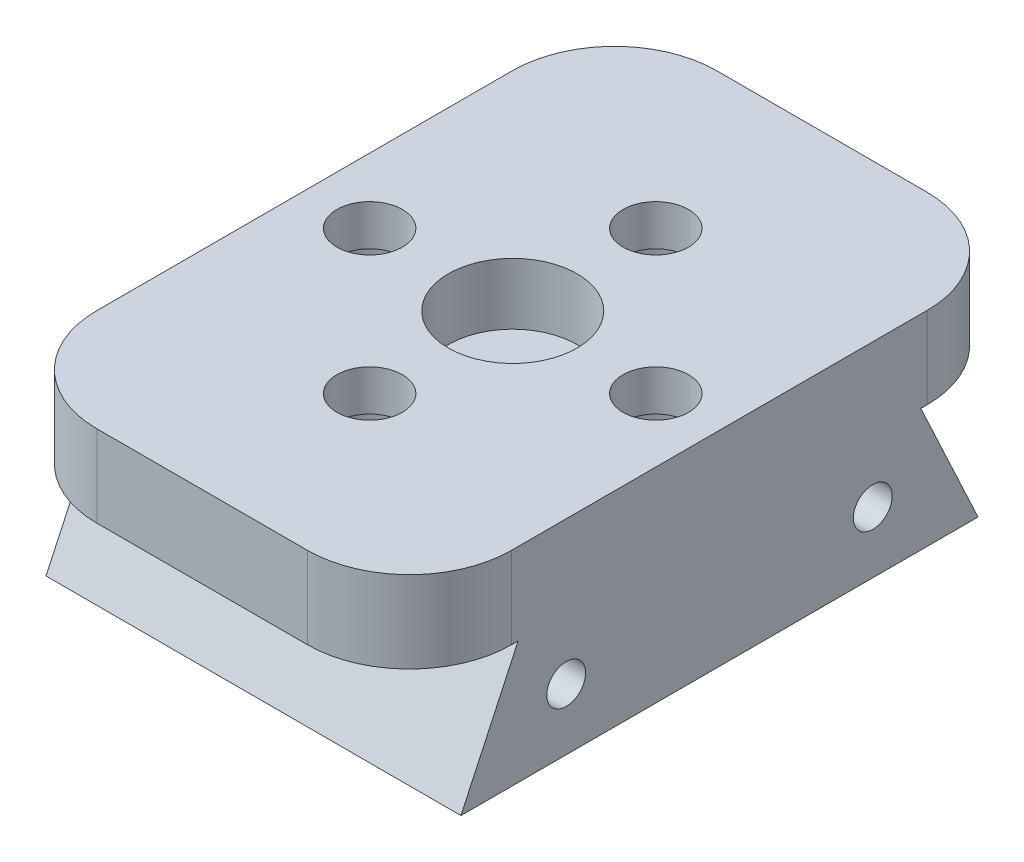
ISO-10303-21;
HEADER;
FILE_DESCRIPTION(('STEP AP214'),'2;1');
FILE_NAME('part.step','',(''),(''),'','','');
FILE_SCHEMA(('AUTOMOTIVE_DESIGN { 1 0 10303 214 1 1 1 1 }'));
ENDSEC;
DATA;
#1=APPLICATION_CONTEXT('core data for automotive mechanical design processes');
#2=APPLICATION_PROTOCOL_DEFINITION('international standard','automotive_design',2000,#1);
#3=PRODUCT_CONTEXT('',#1,'mechanical');
#4=PRODUCT('Part','Part','',(#3));
#5=PRODUCT_RELATED_PRODUCT_CATEGORY('part','',(#4));
#6=PRODUCT_DEFINITION_FORMATION('','',#4);
#7=PRODUCT_DEFINITION_CONTEXT('part definition',#1,'design');
#8=PRODUCT_DEFINITION('design','',#6,#7);
#9=PRODUCT_DEFINITION_SHAPE('','',#8);
#10=(LENGTH_UNIT() NAMED_UNIT(*) SI_UNIT(.MILLI.,.METRE.));
#11=(NAMED_UNIT(*) PLANE_ANGLE_UNIT() SI_UNIT($,.RADIAN.));
#12=(NAMED_UNIT(*) SI_UNIT($,.STERADIAN.) SOLID_ANGLE_UNIT());
#13=UNCERTAINTY_MEASURE_WITH_UNIT(LENGTH_MEASURE(1.E-05),#10,'distance_accuracy_value','');
#14=(GEOMETRIC_REPRESENTATION_CONTEXT(3) GLOBAL_UNCERTAINTY_ASSIGNED_CONTEXT((#13)) GLOBAL_UNIT_ASSIGNED_CONTEXT((#10,
#11,#12)) REPRESENTATION_CONTEXT('',''));
#15=CARTESIAN_POINT('',(0.,0.,0.));
#16=DIRECTION('',(0.,0.,1.));
#17=DIRECTION('',(1.,0.,0.));
#18=AXIS2_PLACEMENT_3D('',#15,#16,#17);
#19=CARTESIAN_POINT('',(-10.185,10.,-15.165));
#20=DIRECTION('',(1.,0.,0.));
#21=DIRECTION('',(0.,0.,-1.));
#22=AXIS2_PLACEMENT_3D('',#19,#20,#21);
#23=PLANE('',#22);
#24=DIRECTION('',(0.,0.,-1.));
#25=VECTOR('',#24,1.);
#26=CARTESIAN_POINT('',(-10.185,6.,9.85));
#27=LINE('',#26,#25);
#28=CARTESIAN_POINT('',(-10.185,6.,10.165));
#29=VERTEX_POINT('',#28);
#30=CARTESIAN_POINT('',(-10.185,6.,9.85));
#31=VERTEX_POINT('',#30);
#32=EDGE_CURVE('E202',#29,#31,#27,.T.);
#33=ORIENTED_EDGE('',*,*,#32,.F.);
#34=DIRECTION('',(0.,-1.,0.));
#35=VECTOR('',#34,1.);
#36=CARTESIAN_POINT('',(-10.185,10.,10.165));
#37=LINE('',#36,#35);
#38=CARTESIAN_POINT('',(-10.185,10.,10.165));
#39=VERTEX_POINT('',#38);
#40=EDGE_CURVE('E270',#29,#39,#37,.F.);
#41=ORIENTED_EDGE('',*,*,#40,.T.);
#42=DIRECTION('',(0.,0.,1.));
#43=VECTOR('',#42,1.);
#44=CARTESIAN_POINT('',(-10.185,10.,-15.165));
#45=LINE('',#44,#43);
#46=CARTESIAN_POINT('',(-10.185,10.,-10.165));
#47=VERTEX_POINT('',#46);
#48=EDGE_CURVE('E211',#47,#39,#45,.T.);
#49=ORIENTED_EDGE('',*,*,#48,.F.);
#50=DIRECTION('',(0.,-1.,0.));
#51=VECTOR('',#50,1.);
#52=CARTESIAN_POINT('',(-10.185,10.,-10.165));
#53=LINE('',#52,#51);
#54=CARTESIAN_POINT('',(-10.185,6.,-10.165));
#55=VERTEX_POINT('',#54);
#56=EDGE_CURVE('E266',#47,#55,#53,.T.);
#57=ORIENTED_EDGE('',*,*,#56,.T.);
#58=DIRECTION('',(0.,0.,-1.));
#59=VECTOR('',#58,1.);
#60=CARTESIAN_POINT('',(-10.185,6.,-15.165));
#61=LINE('',#60,#59);
#62=CARTESIAN_POINT('',(-10.185,6.,-9.85));
#63=VERTEX_POINT('',#62);
#64=EDGE_CURVE('E368',#63,#55,#61,.T.);
#65=ORIENTED_EDGE('',*,*,#64,.F.);
#66=DIRECTION('',(0.,0.906307787036648,0.422618261740704));
#67=VECTOR('',#66,1.);
#68=CARTESIAN_POINT('',(-10.185,6.,-9.85));
#69=LINE('',#68,#67);
#70=CARTESIAN_POINT('',(-10.185,0.,-12.64784594893));
#71=VERTEX_POINT('',#70);
#72=EDGE_CURVE('E171',#71,#63,#69,.T.);
#73=ORIENTED_EDGE('',*,*,#72,.F.);
#74=DIRECTION('',(0.,0.,1.));
#75=VECTOR('',#74,1.);
#76=CARTESIAN_POINT('',(-10.185,0.,-15.165));
#77=LINE('',#76,#75);
#78=CARTESIAN_POINT('',(-10.185,0.,12.64784594893));
#79=VERTEX_POINT('',#78);
#80=EDGE_CURVE('E227',#71,#79,#77,.T.);
#81=ORIENTED_EDGE('',*,*,#80,.T.);
#82=DIRECTION('',(0.,-0.906307787036647,0.422618261740704));
#83=VECTOR('',#82,1.);
#84=CARTESIAN_POINT('',(-10.185,0.,12.64784594893));
#85=LINE('',#84,#83);
#86=EDGE_CURVE('E199',#31,#79,#85,.T.);
#87=ORIENTED_EDGE('',*,*,#86,.F.);
#88=EDGE_LOOP('',(#33,#41,#49,#57,#65,#73,#81,#87));
#89=FACE_BOUND('',#88,.T.);
#90=ADVANCED_FACE('F47',(#89),#23,.F.);
#91=CARTESIAN_POINT('',(-10.185,10.,15.165));
#92=DIRECTION('',(0.,0.,-1.));
#93=DIRECTION('',(-1.,0.,0.));
#94=AXIS2_PLACEMENT_3D('',#91,#92,#93);
#95=PLANE('',#94);
#96=DIRECTION('',(1.,0.,0.));
#97=VECTOR('',#96,1.);
#98=CARTESIAN_POINT('',(-10.185,10.,15.165));
#99=LINE('',#98,#97);
#100=CARTESIAN_POINT('',(-5.185,10.,15.165));
#101=VERTEX_POINT('',#100);
#102=CARTESIAN_POINT('',(5.115,10.,15.165));
#103=VERTEX_POINT('',#102);
#104=EDGE_CURVE('E215',#101,#103,#99,.T.);
#105=ORIENTED_EDGE('',*,*,#104,.F.);
#106=DIRECTION('',(0.,-1.,0.));
#107=VECTOR('',#106,1.);
#108=CARTESIAN_POINT('',(-5.185,10.,15.165));
#109=LINE('',#108,#107);
#110=CARTESIAN_POINT('',(-5.185,6.,15.165));
#111=VERTEX_POINT('',#110);
#112=EDGE_CURVE('E256',#101,#111,#109,.T.);
#113=ORIENTED_EDGE('',*,*,#112,.T.);
#114=DIRECTION('',(-1.,0.,0.));
#115=VECTOR('',#114,1.);
#116=CARTESIAN_POINT('',(10.115,6.,15.165));
#117=LINE('',#116,#115);
#118=CARTESIAN_POINT('',(5.115,6.,15.165));
#119=VERTEX_POINT('',#118);
#120=EDGE_CURVE('E184',#119,#111,#117,.T.);
#121=ORIENTED_EDGE('',*,*,#120,.F.);
#122=DIRECTION('',(0.,-1.,0.));
#123=VECTOR('',#122,1.);
#124=CARTESIAN_POINT('',(5.115,10.,15.165));
#125=LINE('',#124,#123);
#126=EDGE_CURVE('E253',#119,#103,#125,.F.);
#127=ORIENTED_EDGE('',*,*,#126,.T.);
#128=EDGE_LOOP('',(#105,#113,#121,#127));
#129=FACE_BOUND('',#128,.T.);
#130=ADVANCED_FACE('F325',(#129),#95,.F.);
#131=CARTESIAN_POINT('',(10.115,10.,-15.165));
#132=DIRECTION('',(-1.,0.,0.));
#133=DIRECTION('',(0.,0.,1.));
#134=AXIS2_PLACEMENT_3D('',#131,#132,#133);
#135=PLANE('',#134);
#136=CARTESIAN_POINT('',(10.115,3.,7.5));
#137=DIRECTION('',(1.,0.,0.));
#138=DIRECTION('',(0.,0.,-1.));
#139=AXIS2_PLACEMENT_3D('',#136,#137,#138);
#140=CIRCLE('',#139,0.95);
#141=CARTESIAN_POINT('',(10.115,3.,6.55));
#142=VERTEX_POINT('',#141);
#143=EDGE_CURVE('E488',#142,#142,#140,.T.);
#144=ORIENTED_EDGE('',*,*,#143,.F.);
#145=EDGE_LOOP('',(#144));
#146=FACE_BOUND('',#145,.T.);
#147=CARTESIAN_POINT('',(10.115,3.,-7.5));
#148=DIRECTION('',(1.,0.,0.));
#149=DIRECTION('',(0.,0.,-1.));
#150=AXIS2_PLACEMENT_3D('',#147,#148,#149);
#151=CIRCLE('',#150,0.949999999999999);
#152=CARTESIAN_POINT('',(10.115,3.,-8.45));
#153=VERTEX_POINT('',#152);
#154=EDGE_CURVE('E491',#153,#153,#151,.T.);
#155=ORIENTED_EDGE('',*,*,#154,.F.);
#156=EDGE_LOOP('',(#155));
#157=FACE_BOUND('',#156,.T.);
#158=DIRECTION('',(0.,0.,-1.));
#159=VECTOR('',#158,1.);
#160=CARTESIAN_POINT('',(10.115,10.,-15.165));
#161=LINE('',#160,#159);
#162=CARTESIAN_POINT('',(10.115,10.,10.165));
#163=VERTEX_POINT('',#162);
#164=CARTESIAN_POINT('',(10.115,10.,-10.165));
#165=VERTEX_POINT('',#164);
#166=EDGE_CURVE('E220',#163,#165,#161,.T.);
#167=ORIENTED_EDGE('',*,*,#166,.F.);
#168=DIRECTION('',(0.,-1.,0.));
#169=VECTOR('',#168,1.);
#170=CARTESIAN_POINT('',(10.115,10.,10.165));
#171=LINE('',#170,#169);
#172=CARTESIAN_POINT('',(10.115,6.,10.165));
#173=VERTEX_POINT('',#172);
#174=EDGE_CURVE('E288',#163,#173,#171,.T.);
#175=ORIENTED_EDGE('',*,*,#174,.T.);
#176=DIRECTION('',(0.,0.,-1.));
#177=VECTOR('',#176,1.);
#178=CARTESIAN_POINT('',(10.115,6.,9.85));
#179=LINE('',#178,#177);
#180=CARTESIAN_POINT('',(10.115,6.,9.85));
#181=VERTEX_POINT('',#180);
#182=EDGE_CURVE('E203',#173,#181,#179,.T.);
#183=ORIENTED_EDGE('',*,*,#182,.T.);
#184=DIRECTION('',(0.,-0.906307787036647,0.422618261740704));
#185=VECTOR('',#184,1.);
#186=CARTESIAN_POINT('',(10.115,0.,12.64784594893));
#187=LINE('',#186,#185);
#188=CARTESIAN_POINT('',(10.115,0.,12.64784594893));
#189=VERTEX_POINT('',#188);
#190=EDGE_CURVE('E188',#181,#189,#187,.T.);
#191=ORIENTED_EDGE('',*,*,#190,.T.);
#192=DIRECTION('',(0.,0.,-1.));
#193=VECTOR('',#192,1.);
#194=CARTESIAN_POINT('',(10.115,0.,-15.165));
#195=LINE('',#194,#193);
#196=CARTESIAN_POINT('',(10.115,0.,-12.64784594893));
#197=VERTEX_POINT('',#196);
#198=EDGE_CURVE('E216',#189,#197,#195,.T.);
#199=ORIENTED_EDGE('',*,*,#198,.T.);
#200=DIRECTION('',(0.,0.906307787036648,0.422618261740704));
#201=VECTOR('',#200,1.);
#202=CARTESIAN_POINT('',(10.115,6.,-9.85));
#203=LINE('',#202,#201);
#204=CARTESIAN_POINT('',(10.115,6.,-9.85));
#205=VERTEX_POINT('',#204);
#206=EDGE_CURVE('E307',#197,#205,#203,.T.);
#207=ORIENTED_EDGE('',*,*,#206,.T.);
#208=DIRECTION('',(0.,0.,-1.));
#209=VECTOR('',#208,1.);
#210=CARTESIAN_POINT('',(10.115,6.,-15.165));
#211=LINE('',#210,#209);
#212=CARTESIAN_POINT('',(10.115,6.,-10.165));
#213=VERTEX_POINT('',#212);
#214=EDGE_CURVE('E179',#205,#213,#211,.T.);
#215=ORIENTED_EDGE('',*,*,#214,.T.);
#216=DIRECTION('',(0.,-1.,0.));
#217=VECTOR('',#216,1.);
#218=CARTESIAN_POINT('',(10.115,10.,-10.165));
#219=LINE('',#218,#217);
#220=EDGE_CURVE('E285',#213,#165,#219,.F.);
#221=ORIENTED_EDGE('',*,*,#220,.T.);
#222=EDGE_LOOP('',(#167,#175,#183,#191,#199,#207,#215,#221));
#223=FACE_BOUND('',#222,.T.);
#224=ADVANCED_FACE('F306',(#146,#157,#223),#135,.F.);
#225=CARTESIAN_POINT('',(-10.185,10.,-15.165));
#226=DIRECTION('',(0.,0.,1.));
#227=DIRECTION('',(1.,0.,0.));
#228=AXIS2_PLACEMENT_3D('',#225,#226,#227);
#229=PLANE('',#228);
#230=DIRECTION('',(-1.,0.,0.));
#231=VECTOR('',#230,1.);
#232=CARTESIAN_POINT('',(10.115,6.,-15.165));
#233=LINE('',#232,#231);
#234=CARTESIAN_POINT('',(5.115,6.,-15.165));
#235=VERTEX_POINT('',#234);
#236=CARTESIAN_POINT('',(-5.185,6.,-15.165));
#237=VERTEX_POINT('',#236);
#238=EDGE_CURVE('E178',#235,#237,#233,.T.);
#239=ORIENTED_EDGE('',*,*,#238,.T.);
#240=DIRECTION('',(0.,-1.,0.));
#241=VECTOR('',#240,1.);
#242=CARTESIAN_POINT('',(-5.185,10.,-15.165));
#243=LINE('',#242,#241);
#244=CARTESIAN_POINT('',(-5.185,10.,-15.165));
#245=VERTEX_POINT('',#244);
#246=EDGE_CURVE('E12',#237,#245,#243,.F.);
#247=ORIENTED_EDGE('',*,*,#246,.T.);
#248=DIRECTION('',(-1.,0.,0.));
#249=VECTOR('',#248,1.);
#250=CARTESIAN_POINT('',(-10.185,10.,-15.165));
#251=LINE('',#250,#249);
#252=CARTESIAN_POINT('',(5.115,10.,-15.165));
#253=VERTEX_POINT('',#252);
#254=EDGE_CURVE('E158',#253,#245,#251,.T.);
#255=ORIENTED_EDGE('',*,*,#254,.F.);
#256=DIRECTION('',(0.,-1.,0.));
#257=VECTOR('',#256,1.);
#258=CARTESIAN_POINT('',(5.115,10.,-15.165));
#259=LINE('',#258,#257);
#260=EDGE_CURVE('E56',#253,#235,#259,.T.);
#261=ORIENTED_EDGE('',*,*,#260,.T.);
#262=EDGE_LOOP('',(#239,#247,#255,#261));
#263=FACE_BOUND('',#262,.T.);
#264=ADVANCED_FACE('F298',(#263),#229,.F.);
#265=CARTESIAN_POINT('',(0.,10.,0.));
#266=DIRECTION('',(0.,1.,0.));
#267=DIRECTION('',(0.,0.,1.));
#268=AXIS2_PLACEMENT_3D('',#265,#266,#267);
#269=PLANE('',#268);
#270=CARTESIAN_POINT('',(0.,10.,0.));
#271=DIRECTION('',(0.,1.,0.));
#272=DIRECTION('',(0.,0.,1.));
#273=AXIS2_PLACEMENT_3D('',#270,#271,#272);
#274=CIRCLE('',#273,3.15);
#275=CARTESIAN_POINT('',(0.,10.,3.15));
#276=VERTEX_POINT('',#275);
#277=EDGE_CURVE('E547',#276,#276,#274,.T.);
#278=ORIENTED_EDGE('',*,*,#277,.F.);
#279=EDGE_LOOP('',(#278));
#280=FACE_BOUND('',#279,.T.);
#281=CARTESIAN_POINT('',(7.,10.,0.));
#282=DIRECTION('',(0.,-1.,0.));
#283=DIRECTION('',(0.,0.,-1.));
#284=AXIS2_PLACEMENT_3D('',#281,#282,#283);
#285=CIRCLE('',#284,1.6);
#286=CARTESIAN_POINT('',(7.,10.,-1.6));
#287=VERTEX_POINT('',#286);
#288=EDGE_CURVE('E198',#287,#287,#285,.T.);
#289=ORIENTED_EDGE('',*,*,#288,.T.);
#290=EDGE_LOOP('',(#289));
#291=FACE_BOUND('',#290,.T.);
#292=CARTESIAN_POINT('',(0.,10.,7.));
#293=DIRECTION('',(0.,-1.,0.));
#294=DIRECTION('',(0.,0.,-1.));
#295=AXIS2_PLACEMENT_3D('',#292,#293,#294);
#296=CIRCLE('',#295,1.6);
#297=CARTESIAN_POINT('',(0.,10.,5.4));
#298=VERTEX_POINT('',#297);
#299=EDGE_CURVE('E360',#298,#298,#296,.T.);
#300=ORIENTED_EDGE('',*,*,#299,.T.);
#301=EDGE_LOOP('',(#300));
#302=FACE_BOUND('',#301,.T.);
#303=CARTESIAN_POINT('',(0.,10.,-7.));
#304=DIRECTION('',(0.,-1.,0.));
#305=DIRECTION('',(0.,0.,-1.));
#306=AXIS2_PLACEMENT_3D('',#303,#304,#305);
#307=CIRCLE('',#306,1.6);
#308=CARTESIAN_POINT('',(0.,10.,-8.6));
#309=VERTEX_POINT('',#308);
#310=EDGE_CURVE('E353',#309,#309,#307,.T.);
#311=ORIENTED_EDGE('',*,*,#310,.T.);
#312=EDGE_LOOP('',(#311));
#313=FACE_BOUND('',#312,.T.);
#314=CARTESIAN_POINT('',(-7.,10.,0.));
#315=DIRECTION('',(0.,-1.,0.));
#316=DIRECTION('',(0.,0.,-1.));
#317=AXIS2_PLACEMENT_3D('',#314,#315,#316);
#318=CIRCLE('',#317,1.6);
#319=CARTESIAN_POINT('',(-7.,10.,-1.6));
#320=VERTEX_POINT('',#319);
#321=EDGE_CURVE('E349',#320,#320,#318,.T.);
#322=ORIENTED_EDGE('',*,*,#321,.T.);
#323=EDGE_LOOP('',(#322));
#324=FACE_BOUND('',#323,.T.);
#325=ORIENTED_EDGE('',*,*,#48,.T.);
#326=CARTESIAN_POINT('',(-5.185,10.,10.165));
#327=DIRECTION('',(0.,1.,0.));
#328=DIRECTION('',(0.,0.,1.));
#329=AXIS2_PLACEMENT_3D('',#326,#327,#328);
#330=CIRCLE('',#329,5.);
#331=EDGE_CURVE('E282',#39,#101,#330,.T.);
#332=ORIENTED_EDGE('',*,*,#331,.T.);
#333=ORIENTED_EDGE('',*,*,#104,.T.);
#334=CARTESIAN_POINT('',(5.115,10.,10.165));
#335=DIRECTION('',(0.,1.,0.));
#336=DIRECTION('',(0.,0.,1.));
#337=AXIS2_PLACEMENT_3D('',#334,#335,#336);
#338=CIRCLE('',#337,5.);
#339=EDGE_CURVE('E279',#103,#163,#338,.T.);
#340=ORIENTED_EDGE('',*,*,#339,.T.);
#341=ORIENTED_EDGE('',*,*,#166,.T.);
#342=CARTESIAN_POINT('',(5.115,10.,-10.165));
#343=DIRECTION('',(0.,1.,0.));
#344=DIRECTION('',(0.,0.,1.));
#345=AXIS2_PLACEMENT_3D('',#342,#343,#344);
#346=CIRCLE('',#345,5.);
#347=EDGE_CURVE('E273',#165,#253,#346,.T.);
#348=ORIENTED_EDGE('',*,*,#347,.T.);
#349=ORIENTED_EDGE('',*,*,#254,.T.);
#350=CARTESIAN_POINT('',(-5.185,10.,-10.165));
#351=DIRECTION('',(0.,1.,0.));
#352=DIRECTION('',(0.,0.,1.));
#353=AXIS2_PLACEMENT_3D('',#350,#351,#352);
#354=CIRCLE('',#353,5.);
#355=EDGE_CURVE('E276',#245,#47,#354,.T.);
#356=ORIENTED_EDGE('',*,*,#355,.T.);
#357=EDGE_LOOP('',(#325,#332,#333,#340,#341,#348,#349,#356));
#358=FACE_BOUND('',#357,.T.);
#359=ADVANCED_FACE('F311',(#280,#291,#302,#313,#324,#358),#269,.T.);
#360=CARTESIAN_POINT('',(0.,0.,0.));
#361=DIRECTION('',(0.,1.,0.));
#362=DIRECTION('',(0.,0.,1.));
#363=AXIS2_PLACEMENT_3D('',#360,#361,#362);
#364=PLANE('',#363);
#365=CARTESIAN_POINT('',(0.,0.,7.));
#366=DIRECTION('',(0.,-1.,0.));
#367=DIRECTION('',(0.,0.,-1.));
#368=AXIS2_PLACEMENT_3D('',#365,#366,#367);
#369=CIRCLE('',#368,3.1);
#370=CARTESIAN_POINT('',(0.,0.,3.9));
#371=VERTEX_POINT('',#370);
#372=EDGE_CURVE('E505',#371,#371,#369,.T.);
#373=ORIENTED_EDGE('',*,*,#372,.F.);
#374=EDGE_LOOP('',(#373));
#375=FACE_BOUND('',#374,.T.);
#376=CARTESIAN_POINT('',(7.,0.,0.));
#377=DIRECTION('',(0.,-1.,0.));
#378=DIRECTION('',(0.,0.,-1.));
#379=AXIS2_PLACEMENT_3D('',#376,#377,#378);
#380=CIRCLE('',#379,3.1);
#381=CARTESIAN_POINT('',(7.,0.,-3.1));
#382=VERTEX_POINT('',#381);
#383=EDGE_CURVE('E509',#382,#382,#380,.T.);
#384=ORIENTED_EDGE('',*,*,#383,.F.);
#385=EDGE_LOOP('',(#384));
#386=FACE_BOUND('',#385,.T.);
#387=CARTESIAN_POINT('',(0.,0.,-7.));
#388=DIRECTION('',(0.,-1.,0.));
#389=DIRECTION('',(0.,0.,-1.));
#390=AXIS2_PLACEMENT_3D('',#387,#388,#389);
#391=CIRCLE('',#390,3.1);
#392=CARTESIAN_POINT('',(0.,0.,-10.1));
#393=VERTEX_POINT('',#392);
#394=EDGE_CURVE('E517',#393,#393,#391,.T.);
#395=ORIENTED_EDGE('',*,*,#394,.F.);
#396=EDGE_LOOP('',(#395));
#397=FACE_BOUND('',#396,.T.);
#398=CARTESIAN_POINT('',(-7.,0.,0.));
#399=DIRECTION('',(0.,-1.,0.));
#400=DIRECTION('',(0.,0.,-1.));
#401=AXIS2_PLACEMENT_3D('',#398,#399,#400);
#402=CIRCLE('',#401,3.1);
#403=CARTESIAN_POINT('',(-7.,0.,-3.1));
#404=VERTEX_POINT('',#403);
#405=EDGE_CURVE('E525',#404,#404,#402,.T.);
#406=ORIENTED_EDGE('',*,*,#405,.F.);
#407=EDGE_LOOP('',(#406));
#408=FACE_BOUND('',#407,.T.);
#409=ORIENTED_EDGE('',*,*,#80,.F.);
#410=DIRECTION('',(-1.,0.,0.));
#411=VECTOR('',#410,1.);
#412=CARTESIAN_POINT('',(10.115,0.,-12.64784594893));
#413=LINE('',#412,#411);
#414=EDGE_CURVE('E174',#197,#71,#413,.T.);
#415=ORIENTED_EDGE('',*,*,#414,.F.);
#416=ORIENTED_EDGE('',*,*,#198,.F.);
#417=DIRECTION('',(-1.,0.,0.));
#418=VECTOR('',#417,1.);
#419=CARTESIAN_POINT('',(10.115,0.,12.64784594893));
#420=LINE('',#419,#418);
#421=EDGE_CURVE('E194',#189,#79,#420,.T.);
#422=ORIENTED_EDGE('',*,*,#421,.T.);
#423=EDGE_LOOP('',(#409,#415,#416,#422));
#424=FACE_BOUND('',#423,.T.);
#425=ADVANCED_FACE('F344',(#375,#386,#397,#408,#424),#364,.F.);
#426=CARTESIAN_POINT('',(10.115,0.,12.64784594893));
#427=DIRECTION('',(0.,-0.422618261740704,-0.906307787036648));
#428=DIRECTION('',(0.,0.906307787036648,-0.422618261740704));
#429=AXIS2_PLACEMENT_3D('',#426,#427,#428);
#430=PLANE('',#429);
#431=DIRECTION('',(-1.,0.,0.));
#432=VECTOR('',#431,1.);
#433=CARTESIAN_POINT('',(10.115,6.,9.85));
#434=LINE('',#433,#432);
#435=CARTESIAN_POINT('',(1.21963109176505,6.,9.85));
#436=VERTEX_POINT('',#435);
#437=EDGE_CURVE('E189',#181,#436,#434,.T.);
#438=ORIENTED_EDGE('',*,*,#437,.T.);
#439=CARTESIAN_POINT('',(0.,12.1118447234522,7.));
#440=DIRECTION('',(0.,-0.422618261740704,-0.906307787036648));
#441=DIRECTION('',(0.,-0.906307787036648,0.422618261740704));
#442=AXIS2_PLACEMENT_3D('',#439,#440,#441);
#443=ELLIPSE('',#442,7.33522490777266,3.1);
#444=CARTESIAN_POINT('',(-1.21963109176505,6.,9.85));
#445=VERTEX_POINT('',#444);
#446=EDGE_CURVE('E166',#436,#445,#443,.T.);
#447=ORIENTED_EDGE('',*,*,#446,.T.);
#448=EDGE_CURVE('E193',#445,#31,#434,.T.);
#449=ORIENTED_EDGE('',*,*,#448,.T.);
#450=ORIENTED_EDGE('',*,*,#86,.T.);
#451=ORIENTED_EDGE('',*,*,#421,.F.);
#452=ORIENTED_EDGE('',*,*,#190,.F.);
#453=EDGE_LOOP('',(#438,#447,#449,#450,#451,#452));
#454=FACE_BOUND('',#453,.T.);
#455=ADVANCED_FACE('F339',(#454),#430,.F.);
#456=CARTESIAN_POINT('',(10.115,6.,9.85));
#457=DIRECTION('',(0.,1.,0.));
#458=DIRECTION('',(0.,0.,1.));
#459=AXIS2_PLACEMENT_3D('',#456,#457,#458);
#460=PLANE('',#459);
#461=ORIENTED_EDGE('',*,*,#120,.T.);
#462=CARTESIAN_POINT('',(-5.185,6.,10.165));
#463=DIRECTION('',(0.,1.,0.));
#464=DIRECTION('',(0.,0.,1.));
#465=AXIS2_PLACEMENT_3D('',#462,#463,#464);
#466=CIRCLE('',#465,5.);
#467=EDGE_CURVE('E263',#111,#29,#466,.F.);
#468=ORIENTED_EDGE('',*,*,#467,.T.);
#469=ORIENTED_EDGE('',*,*,#32,.T.);
#470=ORIENTED_EDGE('',*,*,#448,.F.);
#471=CARTESIAN_POINT('',(0.,6.,7.));
#472=DIRECTION('',(0.,1.,0.));
#473=DIRECTION('',(0.,0.,1.));
#474=AXIS2_PLACEMENT_3D('',#471,#472,#473);
#475=CIRCLE('',#474,3.1);
#476=EDGE_CURVE('E157',#445,#436,#475,.T.);
#477=ORIENTED_EDGE('',*,*,#476,.T.);
#478=ORIENTED_EDGE('',*,*,#437,.F.);
#479=ORIENTED_EDGE('',*,*,#182,.F.);
#480=CARTESIAN_POINT('',(5.115,6.,10.165));
#481=DIRECTION('',(0.,1.,0.));
#482=DIRECTION('',(0.,0.,1.));
#483=AXIS2_PLACEMENT_3D('',#480,#481,#482);
#484=CIRCLE('',#483,5.);
#485=EDGE_CURVE('E260',#173,#119,#484,.F.);
#486=ORIENTED_EDGE('',*,*,#485,.T.);
#487=EDGE_LOOP('',(#461,#468,#469,#470,#477,#478,#479,#486));
#488=FACE_BOUND('',#487,.T.);
#489=ADVANCED_FACE('F321',(#488),#460,.F.);
#490=CARTESIAN_POINT('',(10.115,6.,-15.165));
#491=DIRECTION('',(0.,1.,0.));
#492=DIRECTION('',(0.,0.,1.));
#493=AXIS2_PLACEMENT_3D('',#490,#491,#492);
#494=PLANE('',#493);
#495=ORIENTED_EDGE('',*,*,#64,.T.);
#496=CARTESIAN_POINT('',(-5.185,6.,-10.165));
#497=DIRECTION('',(0.,1.,0.));
#498=DIRECTION('',(0.,0.,1.));
#499=AXIS2_PLACEMENT_3D('',#496,#497,#498);
#500=CIRCLE('',#499,5.);
#501=EDGE_CURVE('E63',#55,#237,#500,.F.);
#502=ORIENTED_EDGE('',*,*,#501,.T.);
#503=ORIENTED_EDGE('',*,*,#238,.F.);
#504=CARTESIAN_POINT('',(5.115,6.,-10.165));
#505=DIRECTION('',(0.,1.,0.));
#506=DIRECTION('',(0.,0.,1.));
#507=AXIS2_PLACEMENT_3D('',#504,#505,#506);
#508=CIRCLE('',#507,5.);
#509=EDGE_CURVE('E71',#235,#213,#508,.F.);
#510=ORIENTED_EDGE('',*,*,#509,.T.);
#511=ORIENTED_EDGE('',*,*,#214,.F.);
#512=DIRECTION('',(-1.,0.,0.));
#513=VECTOR('',#512,1.);
#514=CARTESIAN_POINT('',(10.115,6.,-9.85));
#515=LINE('',#514,#513);
#516=CARTESIAN_POINT('',(1.21963109176505,6.,-9.85));
#517=VERTEX_POINT('',#516);
#518=EDGE_CURVE('E164',#205,#517,#515,.T.);
#519=ORIENTED_EDGE('',*,*,#518,.T.);
#520=CARTESIAN_POINT('',(0.,6.,-7.));
#521=DIRECTION('',(0.,1.,0.));
#522=DIRECTION('',(0.,0.,1.));
#523=AXIS2_PLACEMENT_3D('',#520,#521,#522);
#524=CIRCLE('',#523,3.1);
#525=CARTESIAN_POINT('',(-1.21963109176504,6.,-9.85));
#526=VERTEX_POINT('',#525);
#527=EDGE_CURVE('E152',#517,#526,#524,.T.);
#528=ORIENTED_EDGE('',*,*,#527,.T.);
#529=EDGE_CURVE('E161',#526,#63,#515,.T.);
#530=ORIENTED_EDGE('',*,*,#529,.T.);
#531=EDGE_LOOP('',(#495,#502,#503,#510,#511,#519,#528,#530));
#532=FACE_BOUND('',#531,.T.);
#533=ADVANCED_FACE('F160',(#532),#494,.F.);
#534=CARTESIAN_POINT('',(10.115,6.,-9.85));
#535=DIRECTION('',(0.,-0.422618261740704,0.906307787036648));
#536=DIRECTION('',(0.,-0.906307787036648,-0.422618261740704));
#537=AXIS2_PLACEMENT_3D('',#534,#535,#536);
#538=PLANE('',#537);
#539=ORIENTED_EDGE('',*,*,#529,.F.);
#540=CARTESIAN_POINT('',(0.,12.1118447234522,-7.));
#541=DIRECTION('',(0.,-0.422618261740704,0.906307787036648));
#542=DIRECTION('',(0.,-0.906307787036648,-0.422618261740704));
#543=AXIS2_PLACEMENT_3D('',#540,#541,#542);
#544=ELLIPSE('',#543,7.33522490777267,3.1);
#545=EDGE_CURVE('E149',#526,#517,#544,.T.);
#546=ORIENTED_EDGE('',*,*,#545,.T.);
#547=ORIENTED_EDGE('',*,*,#518,.F.);
#548=ORIENTED_EDGE('',*,*,#206,.F.);
#549=ORIENTED_EDGE('',*,*,#414,.T.);
#550=ORIENTED_EDGE('',*,*,#72,.T.);
#551=EDGE_LOOP('',(#539,#546,#547,#548,#549,#550));
#552=FACE_BOUND('',#551,.T.);
#553=ADVANCED_FACE('F169',(#552),#538,.F.);
#554=CARTESIAN_POINT('',(-7.,10.,0.));
#555=DIRECTION('',(0.,-1.,0.));
#556=DIRECTION('',(0.,0.,-1.));
#557=AXIS2_PLACEMENT_3D('',#554,#555,#556);
#558=CYLINDRICAL_SURFACE('',#557,1.6);
#559=CARTESIAN_POINT('',(-7.,8.,0.));
#560=DIRECTION('',(0.,1.,0.));
#561=DIRECTION('',(0.,0.,1.));
#562=AXIS2_PLACEMENT_3D('',#559,#560,#561);
#563=CIRCLE('',#562,1.6);
#564=CARTESIAN_POINT('',(-7.,8.,1.6));
#565=VERTEX_POINT('',#564);
#566=EDGE_CURVE('E167',#565,#565,#563,.F.);
#567=ORIENTED_EDGE('',*,*,#566,.T.);
#568=EDGE_LOOP('',(#567));
#569=FACE_BOUND('',#568,.T.);
#570=ORIENTED_EDGE('',*,*,#321,.F.);
#571=EDGE_LOOP('',(#570));
#572=FACE_BOUND('',#571,.T.);
#573=ADVANCED_FACE('F462',(#569,#572),#558,.F.);
#574=CARTESIAN_POINT('',(0.,10.,-7.));
#575=DIRECTION('',(0.,-1.,0.));
#576=DIRECTION('',(0.,0.,-1.));
#577=AXIS2_PLACEMENT_3D('',#574,#575,#576);
#578=CYLINDRICAL_SURFACE('',#577,1.6);
#579=CARTESIAN_POINT('',(0.,8.,-7.));
#580=DIRECTION('',(0.,1.,0.));
#581=DIRECTION('',(0.,0.,1.));
#582=AXIS2_PLACEMENT_3D('',#579,#580,#581);
#583=CIRCLE('',#582,1.6);
#584=CARTESIAN_POINT('',(0.,8.,-5.4));
#585=VERTEX_POINT('',#584);
#586=EDGE_CURVE('E243',#585,#585,#583,.F.);
#587=ORIENTED_EDGE('',*,*,#586,.T.);
#588=EDGE_LOOP('',(#587));
#589=FACE_BOUND('',#588,.T.);
#590=ORIENTED_EDGE('',*,*,#310,.F.);
#591=EDGE_LOOP('',(#590));
#592=FACE_BOUND('',#591,.T.);
#593=ADVANCED_FACE('F458',(#589,#592),#578,.F.);
#594=CARTESIAN_POINT('',(0.,10.,7.));
#595=DIRECTION('',(0.,-1.,0.));
#596=DIRECTION('',(0.,0.,-1.));
#597=AXIS2_PLACEMENT_3D('',#594,#595,#596);
#598=CYLINDRICAL_SURFACE('',#597,1.6);
#599=CARTESIAN_POINT('',(0.,8.,7.));
#600=DIRECTION('',(0.,1.,0.));
#601=DIRECTION('',(0.,0.,1.));
#602=AXIS2_PLACEMENT_3D('',#599,#600,#601);
#603=CIRCLE('',#602,1.6);
#604=CARTESIAN_POINT('',(0.,8.,8.6));
#605=VERTEX_POINT('',#604);
#606=EDGE_CURVE('E238',#605,#605,#603,.F.);
#607=ORIENTED_EDGE('',*,*,#606,.T.);
#608=EDGE_LOOP('',(#607));
#609=FACE_BOUND('',#608,.T.);
#610=ORIENTED_EDGE('',*,*,#299,.F.);
#611=EDGE_LOOP('',(#610));
#612=FACE_BOUND('',#611,.T.);
#613=ADVANCED_FACE('F454',(#609,#612),#598,.F.);
#614=CARTESIAN_POINT('',(7.,10.,0.));
#615=DIRECTION('',(0.,-1.,0.));
#616=DIRECTION('',(0.,0.,-1.));
#617=AXIS2_PLACEMENT_3D('',#614,#615,#616);
#618=CYLINDRICAL_SURFACE('',#617,1.6);
#619=CARTESIAN_POINT('',(7.,8.,0.));
#620=DIRECTION('',(0.,1.,0.));
#621=DIRECTION('',(0.,0.,1.));
#622=AXIS2_PLACEMENT_3D('',#619,#620,#621);
#623=CIRCLE('',#622,1.6);
#624=CARTESIAN_POINT('',(7.,8.,1.6));
#625=VERTEX_POINT('',#624);
#626=EDGE_CURVE('E234',#625,#625,#623,.F.);
#627=ORIENTED_EDGE('',*,*,#626,.T.);
#628=EDGE_LOOP('',(#627));
#629=FACE_BOUND('',#628,.T.);
#630=ORIENTED_EDGE('',*,*,#288,.F.);
#631=EDGE_LOOP('',(#630));
#632=FACE_BOUND('',#631,.T.);
#633=ADVANCED_FACE('F433',(#629,#632),#618,.F.);
#634=CARTESIAN_POINT('',(0.,8.,0.));
#635=DIRECTION('',(0.,1.,0.));
#636=DIRECTION('',(0.,0.,1.));
#637=AXIS2_PLACEMENT_3D('',#634,#635,#636);
#638=PLANE('',#637);
#639=CARTESIAN_POINT('',(7.,8.,0.));
#640=DIRECTION('',(0.,1.,0.));
#641=DIRECTION('',(0.,0.,1.));
#642=AXIS2_PLACEMENT_3D('',#639,#640,#641);
#643=CIRCLE('',#642,3.1);
#644=CARTESIAN_POINT('',(7.,8.,3.1));
#645=VERTEX_POINT('',#644);
#646=EDGE_CURVE('E513',#645,#645,#643,.F.);
#647=ORIENTED_EDGE('',*,*,#646,.T.);
#648=EDGE_LOOP('',(#647));
#649=FACE_BOUND('',#648,.T.);
#650=ORIENTED_EDGE('',*,*,#626,.F.);
#651=EDGE_LOOP('',(#650));
#652=FACE_BOUND('',#651,.T.);
#653=ADVANCED_FACE('F430',(#649,#652),#638,.F.);
#654=CARTESIAN_POINT('',(7.,18.7681240867132,0.));
#655=DIRECTION('',(0.,-1.,0.));
#656=DIRECTION('',(0.,0.,-1.));
#657=AXIS2_PLACEMENT_3D('',#654,#655,#656);
#658=CYLINDRICAL_SURFACE('',#657,3.1);
#659=ORIENTED_EDGE('',*,*,#383,.T.);
#660=EDGE_LOOP('',(#659));
#661=FACE_BOUND('',#660,.T.);
#662=ORIENTED_EDGE('',*,*,#646,.F.);
#663=EDGE_LOOP('',(#662));
#664=FACE_BOUND('',#663,.T.);
#665=ADVANCED_FACE('F425',(#661,#664),#658,.F.);
#666=CARTESIAN_POINT('',(0.,18.7681240867132,7.));
#667=DIRECTION('',(0.,-1.,0.));
#668=DIRECTION('',(0.,0.,-1.));
#669=AXIS2_PLACEMENT_3D('',#666,#667,#668);
#670=CYLINDRICAL_SURFACE('',#669,3.1);
#671=ORIENTED_EDGE('',*,*,#372,.T.);
#672=EDGE_LOOP('',(#671));
#673=FACE_BOUND('',#672,.T.);
#674=CARTESIAN_POINT('',(0.,8.,7.));
#675=DIRECTION('',(0.,1.,0.));
#676=DIRECTION('',(0.,0.,1.));
#677=AXIS2_PLACEMENT_3D('',#674,#675,#676);
#678=CIRCLE('',#677,3.1);
#679=CARTESIAN_POINT('',(0.,8.,10.1));
#680=VERTEX_POINT('',#679);
#681=EDGE_CURVE('E239',#680,#680,#678,.F.);
#682=ORIENTED_EDGE('',*,*,#681,.F.);
#683=EDGE_LOOP('',(#682));
#684=FACE_BOUND('',#683,.T.);
#685=ORIENTED_EDGE('',*,*,#476,.F.);
#686=ORIENTED_EDGE('',*,*,#446,.F.);
#687=EDGE_LOOP('',(#685,#686));
#688=FACE_BOUND('',#687,.T.);
#689=ADVANCED_FACE('F347',(#673,#684,#688),#670,.F.);
#690=CARTESIAN_POINT('',(0.,8.,0.));
#691=DIRECTION('',(0.,1.,0.));
#692=DIRECTION('',(0.,0.,1.));
#693=AXIS2_PLACEMENT_3D('',#690,#691,#692);
#694=PLANE('',#693);
#695=ORIENTED_EDGE('',*,*,#681,.T.);
#696=EDGE_LOOP('',(#695));
#697=FACE_BOUND('',#696,.T.);
#698=ORIENTED_EDGE('',*,*,#606,.F.);
#699=EDGE_LOOP('',(#698));
#700=FACE_BOUND('',#699,.T.);
#701=ADVANCED_FACE('F424',(#697,#700),#694,.F.);
#702=CARTESIAN_POINT('',(0.,18.7681240867132,-7.));
#703=DIRECTION('',(0.,-1.,0.));
#704=DIRECTION('',(0.,0.,-1.));
#705=AXIS2_PLACEMENT_3D('',#702,#703,#704);
#706=CYLINDRICAL_SURFACE('',#705,3.1);
#707=ORIENTED_EDGE('',*,*,#394,.T.);
#708=EDGE_LOOP('',(#707));
#709=FACE_BOUND('',#708,.T.);
#710=CARTESIAN_POINT('',(0.,8.,-7.));
#711=DIRECTION('',(0.,1.,0.));
#712=DIRECTION('',(0.,0.,1.));
#713=AXIS2_PLACEMENT_3D('',#710,#711,#712);
#714=CIRCLE('',#713,3.1);
#715=CARTESIAN_POINT('',(0.,8.,-3.9));
#716=VERTEX_POINT('',#715);
#717=EDGE_CURVE('E521',#716,#716,#714,.F.);
#718=ORIENTED_EDGE('',*,*,#717,.F.);
#719=EDGE_LOOP('',(#718));
#720=FACE_BOUND('',#719,.T.);
#721=ORIENTED_EDGE('',*,*,#545,.F.);
#722=ORIENTED_EDGE('',*,*,#527,.F.);
#723=EDGE_LOOP('',(#721,#722));
#724=FACE_BOUND('',#723,.T.);
#725=ADVANCED_FACE('F151',(#709,#720,#724),#706,.F.);
#726=CARTESIAN_POINT('',(0.,8.,0.));
#727=DIRECTION('',(0.,1.,0.));
#728=DIRECTION('',(0.,0.,1.));
#729=AXIS2_PLACEMENT_3D('',#726,#727,#728);
#730=PLANE('',#729);
#731=ORIENTED_EDGE('',*,*,#717,.T.);
#732=EDGE_LOOP('',(#731));
#733=FACE_BOUND('',#732,.T.);
#734=ORIENTED_EDGE('',*,*,#586,.F.);
#735=EDGE_LOOP('',(#734));
#736=FACE_BOUND('',#735,.T.);
#737=ADVANCED_FACE('F438',(#733,#736),#730,.F.);
#738=CARTESIAN_POINT('',(0.,8.,0.));
#739=DIRECTION('',(0.,1.,0.));
#740=DIRECTION('',(0.,0.,1.));
#741=AXIS2_PLACEMENT_3D('',#738,#739,#740);
#742=PLANE('',#741);
#743=CARTESIAN_POINT('',(-7.,8.,0.));
#744=DIRECTION('',(0.,1.,0.));
#745=DIRECTION('',(0.,0.,1.));
#746=AXIS2_PLACEMENT_3D('',#743,#744,#745);
#747=CIRCLE('',#746,3.1);
#748=CARTESIAN_POINT('',(-7.,8.,3.1));
#749=VERTEX_POINT('',#748);
#750=EDGE_CURVE('E529',#749,#749,#747,.F.);
#751=ORIENTED_EDGE('',*,*,#750,.T.);
#752=EDGE_LOOP('',(#751));
#753=FACE_BOUND('',#752,.T.);
#754=ORIENTED_EDGE('',*,*,#566,.F.);
#755=EDGE_LOOP('',(#754));
#756=FACE_BOUND('',#755,.T.);
#757=ADVANCED_FACE('F441',(#753,#756),#742,.F.);
#758=CARTESIAN_POINT('',(-7.,18.7681240867132,0.));
#759=DIRECTION('',(0.,-1.,0.));
#760=DIRECTION('',(0.,0.,-1.));
#761=AXIS2_PLACEMENT_3D('',#758,#759,#760);
#762=CYLINDRICAL_SURFACE('',#761,3.1);
#763=ORIENTED_EDGE('',*,*,#405,.T.);
#764=EDGE_LOOP('',(#763));
#765=FACE_BOUND('',#764,.T.);
#766=ORIENTED_EDGE('',*,*,#750,.F.);
#767=EDGE_LOOP('',(#766));
#768=FACE_BOUND('',#767,.T.);
#769=ADVANCED_FACE('F417',(#765,#768),#762,.F.);
#770=CARTESIAN_POINT('',(5.115,3.,-7.5));
#771=DIRECTION('',(1.,0.,0.));
#772=DIRECTION('',(0.,0.,-1.));
#773=AXIS2_PLACEMENT_3D('',#770,#771,#772);
#774=CYLINDRICAL_SURFACE('',#773,0.949999999999999);
#775=CARTESIAN_POINT('',(5.115,3.,-7.5));
#776=DIRECTION('',(1.,0.,0.));
#777=DIRECTION('',(0.,0.,-1.));
#778=AXIS2_PLACEMENT_3D('',#775,#776,#777);
#779=CIRCLE('',#778,0.949999999999999);
#780=CARTESIAN_POINT('',(5.115,3.,-8.45));
#781=VERTEX_POINT('',#780);
#782=EDGE_CURVE('E494',#781,#781,#779,.T.);
#783=ORIENTED_EDGE('',*,*,#782,.F.);
#784=EDGE_LOOP('',(#783));
#785=FACE_BOUND('',#784,.T.);
#786=ORIENTED_EDGE('',*,*,#154,.T.);
#787=EDGE_LOOP('',(#786));
#788=FACE_BOUND('',#787,.T.);
#789=ADVANCED_FACE('F414',(#785,#788),#774,.F.);
#790=CARTESIAN_POINT('',(5.115,3.,-7.5));
#791=DIRECTION('',(1.,0.,0.));
#792=DIRECTION('',(0.,0.,-1.));
#793=AXIS2_PLACEMENT_3D('',#790,#791,#792);
#794=PLANE('',#793);
#795=ORIENTED_EDGE('',*,*,#782,.T.);
#796=EDGE_LOOP('',(#795));
#797=FACE_BOUND('',#796,.T.);
#798=ADVANCED_FACE('F412',(#797),#794,.T.);
#799=CARTESIAN_POINT('',(5.115,3.,7.5));
#800=DIRECTION('',(1.,0.,0.));
#801=DIRECTION('',(0.,0.,-1.));
#802=AXIS2_PLACEMENT_3D('',#799,#800,#801);
#803=CYLINDRICAL_SURFACE('',#802,0.95);
#804=CARTESIAN_POINT('',(5.115,3.,7.5));
#805=DIRECTION('',(1.,0.,0.));
#806=DIRECTION('',(0.,0.,-1.));
#807=AXIS2_PLACEMENT_3D('',#804,#805,#806);
#808=CIRCLE('',#807,0.95);
#809=CARTESIAN_POINT('',(5.115,3.,6.55));
#810=VERTEX_POINT('',#809);
#811=EDGE_CURVE('E498',#810,#810,#808,.T.);
#812=ORIENTED_EDGE('',*,*,#811,.F.);
#813=EDGE_LOOP('',(#812));
#814=FACE_BOUND('',#813,.T.);
#815=ORIENTED_EDGE('',*,*,#143,.T.);
#816=EDGE_LOOP('',(#815));
#817=FACE_BOUND('',#816,.T.);
#818=ADVANCED_FACE('F408',(#814,#817),#803,.F.);
#819=CARTESIAN_POINT('',(5.115,3.,7.5));
#820=DIRECTION('',(1.,0.,0.));
#821=DIRECTION('',(0.,0.,-1.));
#822=AXIS2_PLACEMENT_3D('',#819,#820,#821);
#823=PLANE('',#822);
#824=ORIENTED_EDGE('',*,*,#811,.T.);
#825=EDGE_LOOP('',(#824));
#826=FACE_BOUND('',#825,.T.);
#827=ADVANCED_FACE('F401',(#826),#823,.T.);
#828=CARTESIAN_POINT('',(0.,7.,0.));
#829=DIRECTION('',(0.,1.,0.));
#830=DIRECTION('',(0.,0.,1.));
#831=AXIS2_PLACEMENT_3D('',#828,#829,#830);
#832=CYLINDRICAL_SURFACE('',#831,3.15);
#833=CARTESIAN_POINT('',(0.,7.,0.));
#834=DIRECTION('',(0.,1.,0.));
#835=DIRECTION('',(0.,0.,1.));
#836=AXIS2_PLACEMENT_3D('',#833,#834,#835);
#837=CIRCLE('',#836,3.15);
#838=CARTESIAN_POINT('',(0.,7.,3.15));
#839=VERTEX_POINT('',#838);
#840=EDGE_CURVE('E501',#839,#839,#837,.T.);
#841=ORIENTED_EDGE('',*,*,#840,.F.);
#842=EDGE_LOOP('',(#841));
#843=FACE_BOUND('',#842,.T.);
#844=ORIENTED_EDGE('',*,*,#277,.T.);
#845=EDGE_LOOP('',(#844));
#846=FACE_BOUND('',#845,.T.);
#847=ADVANCED_FACE('F395',(#843,#846),#832,.F.);
#848=CARTESIAN_POINT('',(0.,7.,0.));
#849=DIRECTION('',(0.,1.,0.));
#850=DIRECTION('',(0.,0.,1.));
#851=AXIS2_PLACEMENT_3D('',#848,#849,#850);
#852=PLANE('',#851);
#853=ORIENTED_EDGE('',*,*,#840,.T.);
#854=EDGE_LOOP('',(#853));
#855=FACE_BOUND('',#854,.T.);
#856=ADVANCED_FACE('F391',(#855),#852,.T.);
#857=CARTESIAN_POINT('',(-5.185,10.,10.165));
#858=DIRECTION('',(0.,-1.,0.));
#859=DIRECTION('',(0.,0.,-1.));
#860=AXIS2_PLACEMENT_3D('',#857,#858,#859);
#861=CYLINDRICAL_SURFACE('',#860,5.);
#862=ORIENTED_EDGE('',*,*,#331,.F.);
#863=ORIENTED_EDGE('',*,*,#40,.F.);
#864=ORIENTED_EDGE('',*,*,#467,.F.);
#865=ORIENTED_EDGE('',*,*,#112,.F.);
#866=EDGE_LOOP('',(#862,#863,#864,#865));
#867=FACE_BOUND('',#866,.T.);
#868=ADVANCED_FACE('F329',(#867),#861,.T.);
#869=CARTESIAN_POINT('',(5.115,10.,10.165));
#870=DIRECTION('',(0.,-1.,0.));
#871=DIRECTION('',(0.,0.,-1.));
#872=AXIS2_PLACEMENT_3D('',#869,#870,#871);
#873=CYLINDRICAL_SURFACE('',#872,5.);
#874=ORIENTED_EDGE('',*,*,#339,.F.);
#875=ORIENTED_EDGE('',*,*,#126,.F.);
#876=ORIENTED_EDGE('',*,*,#485,.F.);
#877=ORIENTED_EDGE('',*,*,#174,.F.);
#878=EDGE_LOOP('',(#874,#875,#876,#877));
#879=FACE_BOUND('',#878,.T.);
#880=ADVANCED_FACE('F317',(#879),#873,.T.);
#881=CARTESIAN_POINT('',(-5.185,10.,-10.165));
#882=DIRECTION('',(0.,-1.,0.));
#883=DIRECTION('',(0.,0.,-1.));
#884=AXIS2_PLACEMENT_3D('',#881,#882,#883);
#885=CYLINDRICAL_SURFACE('',#884,5.);
#886=ORIENTED_EDGE('',*,*,#355,.F.);
#887=ORIENTED_EDGE('',*,*,#246,.F.);
#888=ORIENTED_EDGE('',*,*,#501,.F.);
#889=ORIENTED_EDGE('',*,*,#56,.F.);
#890=EDGE_LOOP('',(#886,#887,#888,#889));
#891=FACE_BOUND('',#890,.T.);
#892=ADVANCED_FACE('F374',(#891),#885,.T.);
#893=CARTESIAN_POINT('',(5.115,10.,-10.165));
#894=DIRECTION('',(0.,-1.,0.));
#895=DIRECTION('',(0.,0.,-1.));
#896=AXIS2_PLACEMENT_3D('',#893,#894,#895);
#897=CYLINDRICAL_SURFACE('',#896,5.);
#898=ORIENTED_EDGE('',*,*,#347,.F.);
#899=ORIENTED_EDGE('',*,*,#220,.F.);
#900=ORIENTED_EDGE('',*,*,#509,.F.);
#901=ORIENTED_EDGE('',*,*,#260,.F.);
#902=EDGE_LOOP('',(#898,#899,#900,#901));
#903=FACE_BOUND('',#902,.T.);
#904=ADVANCED_FACE('F49',(#903),#897,.T.);
#905=CLOSED_SHELL('',(#90,#130,#224,#264,#359,#425,#455,#489,#533,#553,#573,#593,#613,#633,#653,
#665,#689,#701,#725,#737,#757,#769,#789,#798,#818,#827,#847,#856,#868,#880,#892,#904));
#906=MANIFOLD_SOLID_BREP('B2',#905);
#907=ADVANCED_BREP_SHAPE_REPRESENTATION('',(#18,#906),#14);
#908=SHAPE_DEFINITION_REPRESENTATION(#9,#907);
ENDSEC;
END-ISO-10303-21;
